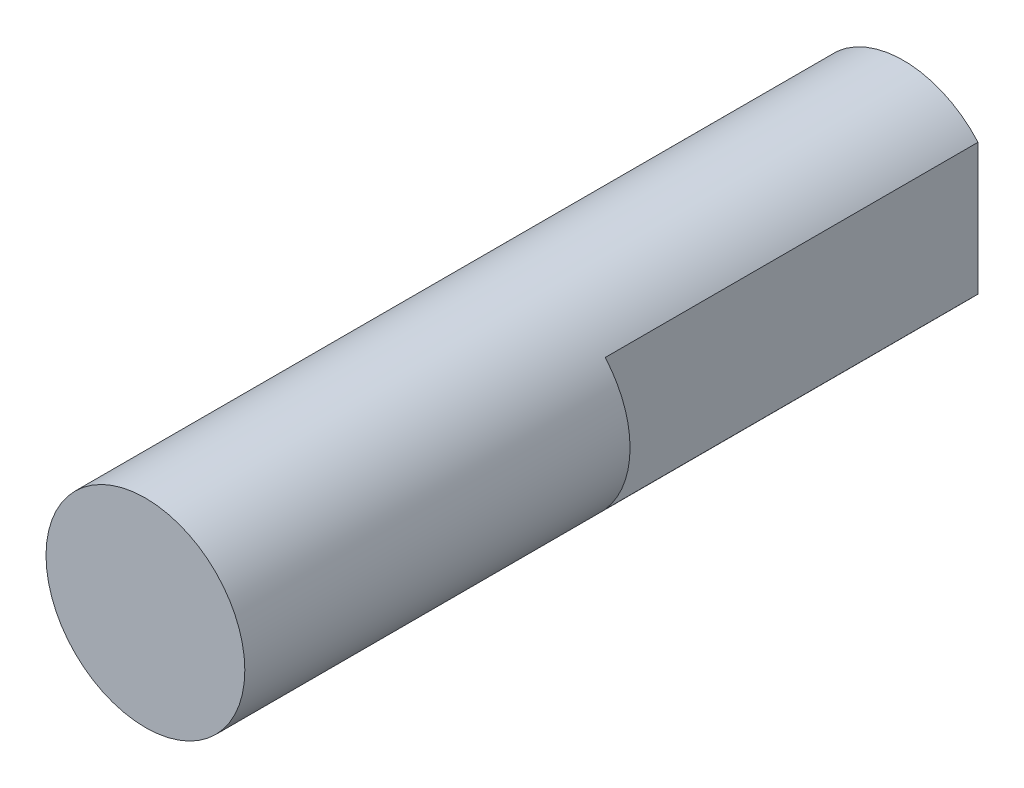
ISO-10303-21;
HEADER;
FILE_DESCRIPTION(('STEP AP214'),'2;1');
FILE_NAME('part.step','',(''),(''),'','','');
FILE_SCHEMA(('AUTOMOTIVE_DESIGN { 1 0 10303 214 1 1 1 1 }'));
ENDSEC;
DATA;
#1=APPLICATION_CONTEXT('core data for automotive mechanical design processes');
#2=APPLICATION_PROTOCOL_DEFINITION('international standard','automotive_design',2000,#1);
#3=PRODUCT_CONTEXT('',#1,'mechanical');
#4=PRODUCT('Part','Part','',(#3));
#5=PRODUCT_RELATED_PRODUCT_CATEGORY('part','',(#4));
#6=PRODUCT_DEFINITION_FORMATION('','',#4);
#7=PRODUCT_DEFINITION_CONTEXT('part definition',#1,'design');
#8=PRODUCT_DEFINITION('design','',#6,#7);
#9=PRODUCT_DEFINITION_SHAPE('','',#8);
#10=(LENGTH_UNIT() NAMED_UNIT(*) SI_UNIT(.MILLI.,.METRE.));
#11=(NAMED_UNIT(*) PLANE_ANGLE_UNIT() SI_UNIT($,.RADIAN.));
#12=(NAMED_UNIT(*) SI_UNIT($,.STERADIAN.) SOLID_ANGLE_UNIT());
#13=UNCERTAINTY_MEASURE_WITH_UNIT(LENGTH_MEASURE(1.E-05),#10,'distance_accuracy_value','');
#14=(GEOMETRIC_REPRESENTATION_CONTEXT(3) GLOBAL_UNCERTAINTY_ASSIGNED_CONTEXT((#13)) GLOBAL_UNIT_ASSIGNED_CONTEXT((#10,
#11,#12)) REPRESENTATION_CONTEXT('',''));
#15=CARTESIAN_POINT('',(0.,0.,0.));
#16=DIRECTION('',(0.,0.,1.));
#17=DIRECTION('',(1.,0.,0.));
#18=AXIS2_PLACEMENT_3D('',#15,#16,#17);
#19=CARTESIAN_POINT('',(0.,0.,-20.5));
#20=DIRECTION('',(0.,0.,1.));
#21=DIRECTION('',(1.,0.,0.));
#22=AXIS2_PLACEMENT_3D('',#19,#20,#21);
#23=CYLINDRICAL_SURFACE('',#22,4.);
#24=CARTESIAN_POINT('',(0.,0.,10.));
#25=DIRECTION('',(0.,0.,1.));
#26=DIRECTION('',(1.,0.,0.));
#27=AXIS2_PLACEMENT_3D('',#24,#25,#26);
#28=CIRCLE('',#27,4.);
#29=CARTESIAN_POINT('',(4.,0.,10.));
#30=VERTEX_POINT('',#29);
#31=EDGE_CURVE('E50',#30,#30,#28,.T.);
#32=ORIENTED_EDGE('',*,*,#31,.F.);
#33=EDGE_LOOP('',(#32));
#34=FACE_BOUND('',#33,.T.);
#35=CARTESIAN_POINT('',(0.,0.,-5.5));
#36=DIRECTION('',(0.,0.,-1.));
#37=DIRECTION('',(-1.,0.,0.));
#38=AXIS2_PLACEMENT_3D('',#35,#36,#37);
#39=CIRCLE('',#38,4.);
#40=CARTESIAN_POINT('',(3.,2.64575131106459,-5.5));
#41=VERTEX_POINT('',#40);
#42=CARTESIAN_POINT('',(3.,-2.64575131106459,-5.5));
#43=VERTEX_POINT('',#42);
#44=EDGE_CURVE('E77',#41,#43,#39,.T.);
#45=ORIENTED_EDGE('',*,*,#44,.F.);
#46=DIRECTION('',(0.,0.,-1.));
#47=VECTOR('',#46,1.);
#48=CARTESIAN_POINT('',(3.,2.64575131106459,-5.5));
#49=LINE('',#48,#47);
#50=CARTESIAN_POINT('',(3.,2.64575131106459,-20.5));
#51=VERTEX_POINT('',#50);
#52=EDGE_CURVE('E70',#41,#51,#49,.T.);
#53=ORIENTED_EDGE('',*,*,#52,.T.);
#54=CARTESIAN_POINT('',(0.,0.,-20.5));
#55=DIRECTION('',(0.,0.,1.));
#56=DIRECTION('',(1.,0.,0.));
#57=AXIS2_PLACEMENT_3D('',#54,#55,#56);
#58=CIRCLE('',#57,4.);
#59=CARTESIAN_POINT('',(3.,-2.64575131106459,-20.5));
#60=VERTEX_POINT('',#59);
#61=EDGE_CURVE('E11',#51,#60,#58,.T.);
#62=ORIENTED_EDGE('',*,*,#61,.T.);
#63=DIRECTION('',(0.,0.,-1.));
#64=VECTOR('',#63,1.);
#65=CARTESIAN_POINT('',(3.,-2.64575131106459,-5.5));
#66=LINE('',#65,#64);
#67=EDGE_CURVE('E57',#43,#60,#66,.T.);
#68=ORIENTED_EDGE('',*,*,#67,.F.);
#69=EDGE_LOOP('',(#45,#53,#62,#68));
#70=FACE_BOUND('',#69,.T.);
#71=ADVANCED_FACE('F42',(#34,#70),#23,.T.);
#72=CARTESIAN_POINT('',(0.,0.,-20.5));
#73=DIRECTION('',(0.,0.,1.));
#74=DIRECTION('',(1.,0.,0.));
#75=AXIS2_PLACEMENT_3D('',#72,#73,#74);
#76=PLANE('',#75);
#77=DIRECTION('',(0.,-1.,0.));
#78=VECTOR('',#77,1.);
#79=CARTESIAN_POINT('',(3.,0.,-20.5));
#80=LINE('',#79,#78);
#81=EDGE_CURVE('E67',#51,#60,#80,.T.);
#82=ORIENTED_EDGE('',*,*,#81,.T.);
#83=ORIENTED_EDGE('',*,*,#61,.F.);
#84=EDGE_LOOP('',(#82,#83));
#85=FACE_BOUND('',#84,.T.);
#86=ADVANCED_FACE('F80',(#85),#76,.F.);
#87=CARTESIAN_POINT('',(0.,0.,10.));
#88=DIRECTION('',(0.,0.,1.));
#89=DIRECTION('',(1.,0.,0.));
#90=AXIS2_PLACEMENT_3D('',#87,#88,#89);
#91=PLANE('',#90);
#92=ORIENTED_EDGE('',*,*,#31,.T.);
#93=EDGE_LOOP('',(#92));
#94=FACE_BOUND('',#93,.T.);
#95=ADVANCED_FACE('F82',(#94),#91,.T.);
#96=CARTESIAN_POINT('',(3.,0.,-5.5));
#97=DIRECTION('',(1.,0.,0.));
#98=DIRECTION('',(0.,0.,-1.));
#99=AXIS2_PLACEMENT_3D('',#96,#97,#98);
#100=PLANE('',#99);
#101=ORIENTED_EDGE('',*,*,#81,.F.);
#102=ORIENTED_EDGE('',*,*,#52,.F.);
#103=DIRECTION('',(0.,-1.,0.));
#104=VECTOR('',#103,1.);
#105=CARTESIAN_POINT('',(3.,0.,-5.5));
#106=LINE('',#105,#104);
#107=EDGE_CURVE('E63',#41,#43,#106,.T.);
#108=ORIENTED_EDGE('',*,*,#107,.T.);
#109=ORIENTED_EDGE('',*,*,#67,.T.);
#110=EDGE_LOOP('',(#101,#102,#108,#109));
#111=FACE_BOUND('',#110,.T.);
#112=ADVANCED_FACE('F69',(#111),#100,.T.);
#113=CARTESIAN_POINT('',(0.,0.,-5.5));
#114=DIRECTION('',(0.,0.,-1.));
#115=DIRECTION('',(-1.,0.,0.));
#116=AXIS2_PLACEMENT_3D('',#113,#114,#115);
#117=PLANE('',#116);
#118=ORIENTED_EDGE('',*,*,#107,.F.);
#119=ORIENTED_EDGE('',*,*,#44,.T.);
#120=EDGE_LOOP('',(#118,#119));
#121=FACE_BOUND('',#120,.T.);
#122=ADVANCED_FACE('F93',(#121),#117,.T.);
#123=CLOSED_SHELL('',(#71,#86,#95,#112,#122));
#124=MANIFOLD_SOLID_BREP('B2',#123);
#125=ADVANCED_BREP_SHAPE_REPRESENTATION('',(#18,#124),#14);
#126=SHAPE_DEFINITION_REPRESENTATION(#9,#125);
ENDSEC;
END-ISO-10303-21;
